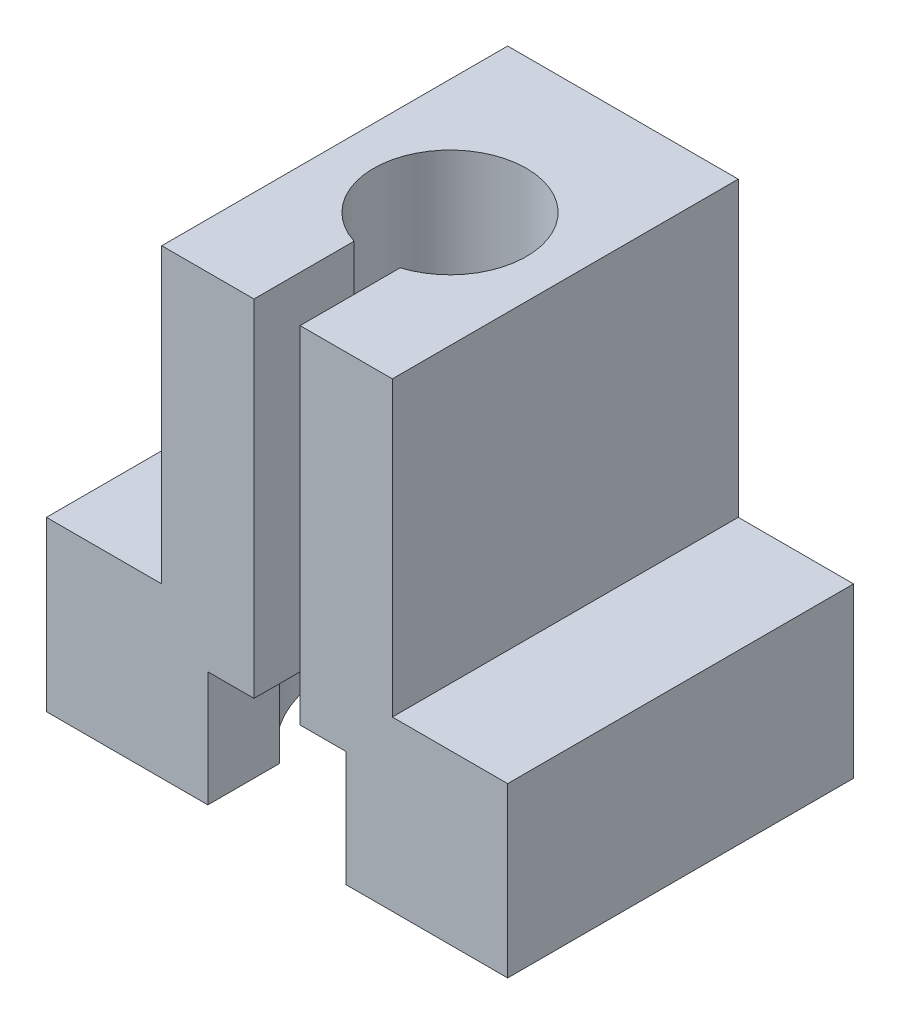
ISO-10303-21;
HEADER;
FILE_DESCRIPTION(('STEP AP214'),'2;1');
FILE_NAME('part.step','',(''),(''),'','','');
FILE_SCHEMA(('AUTOMOTIVE_DESIGN { 1 0 10303 214 1 1 1 1 }'));
ENDSEC;
DATA;
#1=APPLICATION_CONTEXT('core data for automotive mechanical design processes');
#2=APPLICATION_PROTOCOL_DEFINITION('international standard','automotive_design',2000,#1);
#3=PRODUCT_CONTEXT('',#1,'mechanical');
#4=PRODUCT('Part','Part','',(#3));
#5=PRODUCT_RELATED_PRODUCT_CATEGORY('part','',(#4));
#6=PRODUCT_DEFINITION_FORMATION('','',#4);
#7=PRODUCT_DEFINITION_CONTEXT('part definition',#1,'design');
#8=PRODUCT_DEFINITION('design','',#6,#7);
#9=PRODUCT_DEFINITION_SHAPE('','',#8);
#10=(LENGTH_UNIT() NAMED_UNIT(*) SI_UNIT(.MILLI.,.METRE.));
#11=(NAMED_UNIT(*) PLANE_ANGLE_UNIT() SI_UNIT($,.RADIAN.));
#12=(NAMED_UNIT(*) SI_UNIT($,.STERADIAN.) SOLID_ANGLE_UNIT());
#13=UNCERTAINTY_MEASURE_WITH_UNIT(LENGTH_MEASURE(1.E-05),#10,'distance_accuracy_value','');
#14=(GEOMETRIC_REPRESENTATION_CONTEXT(3) GLOBAL_UNCERTAINTY_ASSIGNED_CONTEXT((#13)) GLOBAL_UNIT_ASSIGNED_CONTEXT((#10,
#11,#12)) REPRESENTATION_CONTEXT('',''));
#15=CARTESIAN_POINT('',(0.,0.,0.));
#16=DIRECTION('',(0.,0.,1.));
#17=DIRECTION('',(1.,0.,0.));
#18=AXIS2_PLACEMENT_3D('',#15,#16,#17);
#19=CARTESIAN_POINT('',(-5.,-7.5,15.));
#20=DIRECTION('',(0.,1.,0.));
#21=DIRECTION('',(0.,0.,1.));
#22=AXIS2_PLACEMENT_3D('',#19,#20,#21);
#23=PLANE('',#22);
#24=DIRECTION('',(0.,0.,1.));
#25=VECTOR('',#24,1.);
#26=CARTESIAN_POINT('',(-3.,-7.5,15.));
#27=LINE('',#26,#25);
#28=CARTESIAN_POINT('',(-3.,-7.5,11.8873938733604));
#29=VERTEX_POINT('',#28);
#30=CARTESIAN_POINT('',(-3.,-7.5,15.));
#31=VERTEX_POINT('',#30);
#32=EDGE_CURVE('E54',#29,#31,#27,.T.);
#33=ORIENTED_EDGE('',*,*,#32,.F.);
#34=CARTESIAN_POINT('',(0.,-7.5,7.50000000000005));
#35=DIRECTION('',(0.,1.,0.));
#36=DIRECTION('',(0.,0.,-1.));
#37=AXIS2_PLACEMENT_3D('',#34,#35,#36);
#38=CIRCLE('',#37,5.315);
#39=CARTESIAN_POINT('',(3.,-7.5,11.8873938733604));
#40=VERTEX_POINT('',#39);
#41=EDGE_CURVE('E177',#40,#29,#38,.T.);
#42=ORIENTED_EDGE('',*,*,#41,.F.);
#43=DIRECTION('',(0.,0.,-1.));
#44=VECTOR('',#43,1.);
#45=CARTESIAN_POINT('',(3.,-7.5,11.8873938733604));
#46=LINE('',#45,#44);
#47=CARTESIAN_POINT('',(3.,-7.5,15.));
#48=VERTEX_POINT('',#47);
#49=EDGE_CURVE('E191',#48,#40,#46,.T.);
#50=ORIENTED_EDGE('',*,*,#49,.F.);
#51=DIRECTION('',(1.,0.,0.));
#52=VECTOR('',#51,1.);
#53=CARTESIAN_POINT('',(-5.,-7.5,15.));
#54=LINE('',#53,#52);
#55=CARTESIAN_POINT('',(1.,-7.5,15.));
#56=VERTEX_POINT('',#55);
#57=EDGE_CURVE('E261',#56,#48,#54,.T.);
#58=ORIENTED_EDGE('',*,*,#57,.F.);
#59=DIRECTION('',(0.,0.,1.));
#60=VECTOR('',#59,1.);
#61=CARTESIAN_POINT('',(1.,-7.5,7.));
#62=LINE('',#61,#60);
#63=CARTESIAN_POINT('',(1.,-7.5,10.6605735239036));
#64=VERTEX_POINT('',#63);
#65=EDGE_CURVE('E212',#64,#56,#62,.T.);
#66=ORIENTED_EDGE('',*,*,#65,.F.);
#67=CARTESIAN_POINT('',(0.,-7.5,7.50000000000005));
#68=DIRECTION('',(0.,-1.,0.));
#69=DIRECTION('',(0.,0.,-1.));
#70=AXIS2_PLACEMENT_3D('',#67,#68,#69);
#71=CIRCLE('',#70,3.315);
#72=CARTESIAN_POINT('',(-1.,-7.5,10.6605735239036));
#73=VERTEX_POINT('',#72);
#74=EDGE_CURVE('E214',#73,#64,#71,.T.);
#75=ORIENTED_EDGE('',*,*,#74,.F.);
#76=DIRECTION('',(0.,0.,1.));
#77=VECTOR('',#76,1.);
#78=CARTESIAN_POINT('',(-1.,-7.5,7.));
#79=LINE('',#78,#77);
#80=CARTESIAN_POINT('',(-1.,-7.5,15.));
#81=VERTEX_POINT('',#80);
#82=EDGE_CURVE('E215',#73,#81,#79,.T.);
#83=ORIENTED_EDGE('',*,*,#82,.T.);
#84=EDGE_CURVE('E59',#31,#81,#54,.T.);
#85=ORIENTED_EDGE('',*,*,#84,.F.);
#86=EDGE_LOOP('',(#33,#42,#50,#58,#66,#75,#83,#85));
#87=FACE_BOUND('',#86,.T.);
#88=ADVANCED_FACE('F39',(#87),#23,.F.);
#89=CARTESIAN_POINT('',(0.,0.,15.));
#90=DIRECTION('',(0.,0.,1.));
#91=DIRECTION('',(1.,0.,0.));
#92=AXIS2_PLACEMENT_3D('',#89,#90,#91);
#93=PLANE('',#92);
#94=DIRECTION('',(0.,1.,0.));
#95=VECTOR('',#94,1.);
#96=CARTESIAN_POINT('',(1.,7.5,15.));
#97=LINE('',#96,#95);
#98=CARTESIAN_POINT('',(1.,7.5,15.));
#99=VERTEX_POINT('',#98);
#100=EDGE_CURVE('E206',#56,#99,#97,.T.);
#101=ORIENTED_EDGE('',*,*,#100,.F.);
#102=ORIENTED_EDGE('',*,*,#57,.T.);
#103=DIRECTION('',(0.,1.,0.));
#104=VECTOR('',#103,1.);
#105=CARTESIAN_POINT('',(3.,-12.5,15.));
#106=LINE('',#105,#104);
#107=CARTESIAN_POINT('',(3.,-12.5,15.));
#108=VERTEX_POINT('',#107);
#109=EDGE_CURVE('E203',#108,#48,#106,.T.);
#110=ORIENTED_EDGE('',*,*,#109,.F.);
#111=DIRECTION('',(-1.,0.,0.));
#112=VECTOR('',#111,1.);
#113=CARTESIAN_POINT('',(3.,-12.5,15.));
#114=LINE('',#113,#112);
#115=CARTESIAN_POINT('',(10.,-12.5,15.));
#116=VERTEX_POINT('',#115);
#117=EDGE_CURVE('E181',#116,#108,#114,.T.);
#118=ORIENTED_EDGE('',*,*,#117,.F.);
#119=DIRECTION('',(0.,1.,0.));
#120=VECTOR('',#119,1.);
#121=CARTESIAN_POINT('',(10.,-5.2,15.));
#122=LINE('',#121,#120);
#123=CARTESIAN_POINT('',(10.,-5.2,15.));
#124=VERTEX_POINT('',#123);
#125=EDGE_CURVE('E235',#116,#124,#122,.T.);
#126=ORIENTED_EDGE('',*,*,#125,.T.);
#127=DIRECTION('',(-1.,0.,0.));
#128=VECTOR('',#127,1.);
#129=CARTESIAN_POINT('',(5.,-5.2,15.));
#130=LINE('',#129,#128);
#131=CARTESIAN_POINT('',(5.,-5.2,15.));
#132=VERTEX_POINT('',#131);
#133=EDGE_CURVE('E229',#124,#132,#130,.T.);
#134=ORIENTED_EDGE('',*,*,#133,.T.);
#135=DIRECTION('',(0.,1.,0.));
#136=VECTOR('',#135,1.);
#137=CARTESIAN_POINT('',(5.,7.5,15.));
#138=LINE('',#137,#136);
#139=CARTESIAN_POINT('',(5.,7.5,15.));
#140=VERTEX_POINT('',#139);
#141=EDGE_CURVE('E251',#132,#140,#138,.T.);
#142=ORIENTED_EDGE('',*,*,#141,.T.);
#143=DIRECTION('',(-1.,0.,0.));
#144=VECTOR('',#143,1.);
#145=CARTESIAN_POINT('',(-5.,7.5,15.));
#146=LINE('',#145,#144);
#147=EDGE_CURVE('E255',#140,#99,#146,.T.);
#148=ORIENTED_EDGE('',*,*,#147,.T.);
#149=EDGE_LOOP('',(#101,#102,#110,#118,#126,#134,#142,#148));
#150=FACE_BOUND('',#149,.T.);
#151=ADVANCED_FACE('F287',(#150),#93,.T.);
#152=CARTESIAN_POINT('',(5.,7.5,15.));
#153=DIRECTION('',(-1.,0.,0.));
#154=DIRECTION('',(0.,0.,1.));
#155=AXIS2_PLACEMENT_3D('',#152,#153,#154);
#156=PLANE('',#155);
#157=DIRECTION('',(0.,0.,1.));
#158=VECTOR('',#157,1.);
#159=CARTESIAN_POINT('',(5.,-5.2,-5.5036351623268));
#160=LINE('',#159,#158);
#161=CARTESIAN_POINT('',(5.,-5.2,0.));
#162=VERTEX_POINT('',#161);
#163=EDGE_CURVE('E230',#162,#132,#160,.T.);
#164=ORIENTED_EDGE('',*,*,#163,.F.);
#165=DIRECTION('',(0.,1.,0.));
#166=VECTOR('',#165,1.);
#167=CARTESIAN_POINT('',(5.,7.5,0.));
#168=LINE('',#167,#166);
#169=CARTESIAN_POINT('',(5.,7.5,0.));
#170=VERTEX_POINT('',#169);
#171=EDGE_CURVE('E250',#162,#170,#168,.T.);
#172=ORIENTED_EDGE('',*,*,#171,.T.);
#173=DIRECTION('',(0.,0.,-1.));
#174=VECTOR('',#173,1.);
#175=CARTESIAN_POINT('',(5.,7.5,15.));
#176=LINE('',#175,#174);
#177=EDGE_CURVE('E271',#140,#170,#176,.T.);
#178=ORIENTED_EDGE('',*,*,#177,.F.);
#179=ORIENTED_EDGE('',*,*,#141,.F.);
#180=EDGE_LOOP('',(#164,#172,#178,#179));
#181=FACE_BOUND('',#180,.T.);
#182=ADVANCED_FACE('F41',(#181),#156,.F.);
#183=CARTESIAN_POINT('',(-5.,7.5,15.));
#184=DIRECTION('',(0.,-1.,0.));
#185=DIRECTION('',(0.,0.,-1.));
#186=AXIS2_PLACEMENT_3D('',#183,#184,#185);
#187=PLANE('',#186);
#188=CARTESIAN_POINT('',(0.,7.5,7.50000000000005));
#189=DIRECTION('',(0.,-1.,0.));
#190=DIRECTION('',(0.,0.,-1.));
#191=AXIS2_PLACEMENT_3D('',#188,#189,#190);
#192=CIRCLE('',#191,3.315);
#193=CARTESIAN_POINT('',(-1.,7.5,10.6605735239036));
#194=VERTEX_POINT('',#193);
#195=CARTESIAN_POINT('',(1.,7.5,10.6605735239036));
#196=VERTEX_POINT('',#195);
#197=EDGE_CURVE('E221',#194,#196,#192,.T.);
#198=ORIENTED_EDGE('',*,*,#197,.T.);
#199=DIRECTION('',(0.,0.,1.));
#200=VECTOR('',#199,1.);
#201=CARTESIAN_POINT('',(1.,7.5,7.));
#202=LINE('',#201,#200);
#203=EDGE_CURVE('E211',#196,#99,#202,.T.);
#204=ORIENTED_EDGE('',*,*,#203,.T.);
#205=ORIENTED_EDGE('',*,*,#147,.F.);
#206=ORIENTED_EDGE('',*,*,#177,.T.);
#207=DIRECTION('',(-1.,0.,0.));
#208=VECTOR('',#207,1.);
#209=CARTESIAN_POINT('',(-5.,7.5,0.));
#210=LINE('',#209,#208);
#211=CARTESIAN_POINT('',(-5.,7.5,0.));
#212=VERTEX_POINT('',#211);
#213=EDGE_CURVE('E265',#170,#212,#210,.T.);
#214=ORIENTED_EDGE('',*,*,#213,.T.);
#215=DIRECTION('',(0.,0.,-1.));
#216=VECTOR('',#215,1.);
#217=CARTESIAN_POINT('',(-5.,7.5,15.));
#218=LINE('',#217,#216);
#219=CARTESIAN_POINT('',(-5.,7.5,15.));
#220=VERTEX_POINT('',#219);
#221=EDGE_CURVE('E263',#220,#212,#218,.T.);
#222=ORIENTED_EDGE('',*,*,#221,.F.);
#223=CARTESIAN_POINT('',(-1.,7.5,15.));
#224=VERTEX_POINT('',#223);
#225=EDGE_CURVE('E253',#224,#220,#146,.T.);
#226=ORIENTED_EDGE('',*,*,#225,.F.);
#227=DIRECTION('',(0.,0.,1.));
#228=VECTOR('',#227,1.);
#229=CARTESIAN_POINT('',(-1.,7.5,7.));
#230=LINE('',#229,#228);
#231=EDGE_CURVE('E217',#194,#224,#230,.T.);
#232=ORIENTED_EDGE('',*,*,#231,.F.);
#233=EDGE_LOOP('',(#198,#204,#205,#206,#214,#222,#226,#232));
#234=FACE_BOUND('',#233,.T.);
#235=ADVANCED_FACE('F292',(#234),#187,.F.);
#236=CARTESIAN_POINT('',(-5.,7.5,15.));
#237=DIRECTION('',(1.,0.,0.));
#238=DIRECTION('',(0.,0.,-1.));
#239=AXIS2_PLACEMENT_3D('',#236,#237,#238);
#240=PLANE('',#239);
#241=DIRECTION('',(0.,-1.,0.));
#242=VECTOR('',#241,1.);
#243=CARTESIAN_POINT('',(-5.,7.5,0.));
#244=LINE('',#243,#242);
#245=CARTESIAN_POINT('',(-5.,-5.2,0.));
#246=VERTEX_POINT('',#245);
#247=EDGE_CURVE('E254',#212,#246,#244,.T.);
#248=ORIENTED_EDGE('',*,*,#247,.T.);
#249=DIRECTION('',(0.,0.,1.));
#250=VECTOR('',#249,1.);
#251=CARTESIAN_POINT('',(-5.,-5.2,-5.5036351623268));
#252=LINE('',#251,#250);
#253=CARTESIAN_POINT('',(-5.,-5.2,15.));
#254=VERTEX_POINT('',#253);
#255=EDGE_CURVE('E245',#246,#254,#252,.T.);
#256=ORIENTED_EDGE('',*,*,#255,.T.);
#257=DIRECTION('',(0.,-1.,0.));
#258=VECTOR('',#257,1.);
#259=CARTESIAN_POINT('',(-5.,7.5,15.));
#260=LINE('',#259,#258);
#261=EDGE_CURVE('E258',#220,#254,#260,.T.);
#262=ORIENTED_EDGE('',*,*,#261,.F.);
#263=ORIENTED_EDGE('',*,*,#221,.T.);
#264=EDGE_LOOP('',(#248,#256,#262,#263));
#265=FACE_BOUND('',#264,.T.);
#266=ADVANCED_FACE('F301',(#265),#240,.F.);
#267=DIRECTION('',(0.,-1.,0.));
#268=VECTOR('',#267,1.);
#269=CARTESIAN_POINT('',(-1.,7.5,15.));
#270=LINE('',#269,#268);
#271=EDGE_CURVE('E208',#224,#81,#270,.T.);
#272=ORIENTED_EDGE('',*,*,#271,.F.);
#273=ORIENTED_EDGE('',*,*,#225,.T.);
#274=ORIENTED_EDGE('',*,*,#261,.T.);
#275=DIRECTION('',(-1.,0.,0.));
#276=VECTOR('',#275,1.);
#277=CARTESIAN_POINT('',(-5.,-5.2,15.));
#278=LINE('',#277,#276);
#279=CARTESIAN_POINT('',(-10.,-5.2,15.));
#280=VERTEX_POINT('',#279);
#281=EDGE_CURVE('E238',#254,#280,#278,.T.);
#282=ORIENTED_EDGE('',*,*,#281,.T.);
#283=DIRECTION('',(0.,-1.,0.));
#284=VECTOR('',#283,1.);
#285=CARTESIAN_POINT('',(-10.,-5.2,15.));
#286=LINE('',#285,#284);
#287=CARTESIAN_POINT('',(-10.,-12.5,15.));
#288=VERTEX_POINT('',#287);
#289=EDGE_CURVE('E243',#280,#288,#286,.T.);
#290=ORIENTED_EDGE('',*,*,#289,.T.);
#291=DIRECTION('',(-1.,0.,0.));
#292=VECTOR('',#291,1.);
#293=CARTESIAN_POINT('',(-10.,-12.5,15.));
#294=LINE('',#293,#292);
#295=CARTESIAN_POINT('',(-3.,-12.5,15.));
#296=VERTEX_POINT('',#295);
#297=EDGE_CURVE('E175',#296,#288,#294,.T.);
#298=ORIENTED_EDGE('',*,*,#297,.F.);
#299=DIRECTION('',(0.,1.,0.));
#300=VECTOR('',#299,1.);
#301=CARTESIAN_POINT('',(-3.,-12.5,15.));
#302=LINE('',#301,#300);
#303=EDGE_CURVE('E190',#296,#31,#302,.T.);
#304=ORIENTED_EDGE('',*,*,#303,.T.);
#305=ORIENTED_EDGE('',*,*,#84,.T.);
#306=EDGE_LOOP('',(#272,#273,#274,#282,#290,#298,#304,#305));
#307=FACE_BOUND('',#306,.T.);
#308=ADVANCED_FACE('F305',(#307),#93,.T.);
#309=CARTESIAN_POINT('',(0.,0.,0.));
#310=DIRECTION('',(0.,0.,1.));
#311=DIRECTION('',(1.,0.,0.));
#312=AXIS2_PLACEMENT_3D('',#309,#310,#311);
#313=PLANE('',#312);
#314=ORIENTED_EDGE('',*,*,#171,.F.);
#315=DIRECTION('',(1.,0.,0.));
#316=VECTOR('',#315,1.);
#317=CARTESIAN_POINT('',(5.,-5.2,0.));
#318=LINE('',#317,#316);
#319=CARTESIAN_POINT('',(10.,-5.2,0.));
#320=VERTEX_POINT('',#319);
#321=EDGE_CURVE('E224',#162,#320,#318,.T.);
#322=ORIENTED_EDGE('',*,*,#321,.T.);
#323=DIRECTION('',(0.,-1.,0.));
#324=VECTOR('',#323,1.);
#325=CARTESIAN_POINT('',(10.,-5.2,0.));
#326=LINE('',#325,#324);
#327=CARTESIAN_POINT('',(10.,-12.5,0.));
#328=VERTEX_POINT('',#327);
#329=EDGE_CURVE('E166',#320,#328,#326,.T.);
#330=ORIENTED_EDGE('',*,*,#329,.T.);
#331=DIRECTION('',(1.,0.,0.));
#332=VECTOR('',#331,1.);
#333=CARTESIAN_POINT('',(10.,-12.5,0.));
#334=LINE('',#333,#332);
#335=CARTESIAN_POINT('',(-10.,-12.5,0.));
#336=VERTEX_POINT('',#335);
#337=EDGE_CURVE('E162',#336,#328,#334,.T.);
#338=ORIENTED_EDGE('',*,*,#337,.F.);
#339=DIRECTION('',(0.,1.,0.));
#340=VECTOR('',#339,1.);
#341=CARTESIAN_POINT('',(-10.,-5.2,0.));
#342=LINE('',#341,#340);
#343=CARTESIAN_POINT('',(-10.,-5.2,0.));
#344=VERTEX_POINT('',#343);
#345=EDGE_CURVE('E150',#336,#344,#342,.T.);
#346=ORIENTED_EDGE('',*,*,#345,.T.);
#347=DIRECTION('',(1.,0.,0.));
#348=VECTOR('',#347,1.);
#349=CARTESIAN_POINT('',(-5.,-5.2,0.));
#350=LINE('',#349,#348);
#351=EDGE_CURVE('E159',#344,#246,#350,.T.);
#352=ORIENTED_EDGE('',*,*,#351,.T.);
#353=ORIENTED_EDGE('',*,*,#247,.F.);
#354=ORIENTED_EDGE('',*,*,#213,.F.);
#355=EDGE_LOOP('',(#314,#322,#330,#338,#346,#352,#353,#354));
#356=FACE_BOUND('',#355,.T.);
#357=ADVANCED_FACE('F164',(#356),#313,.F.);
#358=CARTESIAN_POINT('',(-10.,-5.2,-5.5036351623268));
#359=DIRECTION('',(-1.,0.,0.));
#360=DIRECTION('',(0.,-1.,0.));
#361=AXIS2_PLACEMENT_3D('',#358,#359,#360);
#362=PLANE('',#361);
#363=ORIENTED_EDGE('',*,*,#345,.F.);
#364=DIRECTION('',(0.,0.,-1.));
#365=VECTOR('',#364,1.);
#366=CARTESIAN_POINT('',(-10.,-12.5,0.));
#367=LINE('',#366,#365);
#368=EDGE_CURVE('E155',#288,#336,#367,.T.);
#369=ORIENTED_EDGE('',*,*,#368,.F.);
#370=ORIENTED_EDGE('',*,*,#289,.F.);
#371=DIRECTION('',(0.,0.,1.));
#372=VECTOR('',#371,1.);
#373=CARTESIAN_POINT('',(-10.,-5.2,-5.5036351623268));
#374=LINE('',#373,#372);
#375=EDGE_CURVE('E156',#344,#280,#374,.T.);
#376=ORIENTED_EDGE('',*,*,#375,.F.);
#377=EDGE_LOOP('',(#363,#369,#370,#376));
#378=FACE_BOUND('',#377,.T.);
#379=ADVANCED_FACE('F152',(#378),#362,.T.);
#380=CARTESIAN_POINT('',(-5.,-5.2,-5.5036351623268));
#381=DIRECTION('',(0.,1.,0.));
#382=DIRECTION('',(0.,0.,1.));
#383=AXIS2_PLACEMENT_3D('',#380,#381,#382);
#384=PLANE('',#383);
#385=ORIENTED_EDGE('',*,*,#351,.F.);
#386=ORIENTED_EDGE('',*,*,#375,.T.);
#387=ORIENTED_EDGE('',*,*,#281,.F.);
#388=ORIENTED_EDGE('',*,*,#255,.F.);
#389=EDGE_LOOP('',(#385,#386,#387,#388));
#390=FACE_BOUND('',#389,.T.);
#391=ADVANCED_FACE('F345',(#390),#384,.T.);
#392=CARTESIAN_POINT('',(5.,-5.2,-5.5036351623268));
#393=DIRECTION('',(0.,1.,0.));
#394=DIRECTION('',(0.,0.,1.));
#395=AXIS2_PLACEMENT_3D('',#392,#393,#394);
#396=PLANE('',#395);
#397=ORIENTED_EDGE('',*,*,#321,.F.);
#398=ORIENTED_EDGE('',*,*,#163,.T.);
#399=ORIENTED_EDGE('',*,*,#133,.F.);
#400=DIRECTION('',(0.,0.,1.));
#401=VECTOR('',#400,1.);
#402=CARTESIAN_POINT('',(10.,-5.2,-5.5036351623268));
#403=LINE('',#402,#401);
#404=EDGE_CURVE('E227',#320,#124,#403,.T.);
#405=ORIENTED_EDGE('',*,*,#404,.F.);
#406=EDGE_LOOP('',(#397,#398,#399,#405));
#407=FACE_BOUND('',#406,.T.);
#408=ADVANCED_FACE('F348',(#407),#396,.T.);
#409=CARTESIAN_POINT('',(10.,-5.2,-5.5036351623268));
#410=DIRECTION('',(1.,0.,0.));
#411=DIRECTION('',(0.,1.,0.));
#412=AXIS2_PLACEMENT_3D('',#409,#410,#411);
#413=PLANE('',#412);
#414=ORIENTED_EDGE('',*,*,#329,.F.);
#415=ORIENTED_EDGE('',*,*,#404,.T.);
#416=ORIENTED_EDGE('',*,*,#125,.F.);
#417=DIRECTION('',(0.,0.,1.));
#418=VECTOR('',#417,1.);
#419=CARTESIAN_POINT('',(10.,-12.5,15.));
#420=LINE('',#419,#418);
#421=EDGE_CURVE('E170',#328,#116,#420,.T.);
#422=ORIENTED_EDGE('',*,*,#421,.F.);
#423=EDGE_LOOP('',(#414,#415,#416,#422));
#424=FACE_BOUND('',#423,.T.);
#425=ADVANCED_FACE('F315',(#424),#413,.T.);
#426=CARTESIAN_POINT('',(0.,7.5,7.50000000000005));
#427=DIRECTION('',(0.,-1.,0.));
#428=DIRECTION('',(0.,0.,-1.));
#429=AXIS2_PLACEMENT_3D('',#426,#427,#428);
#430=CYLINDRICAL_SURFACE('',#429,3.315);
#431=ORIENTED_EDGE('',*,*,#74,.T.);
#432=DIRECTION('',(0.,-1.,0.));
#433=VECTOR('',#432,1.);
#434=CARTESIAN_POINT('',(1.,7.5,10.6605735239036));
#435=LINE('',#434,#433);
#436=EDGE_CURVE('E11',#64,#196,#435,.F.);
#437=ORIENTED_EDGE('',*,*,#436,.T.);
#438=ORIENTED_EDGE('',*,*,#197,.F.);
#439=DIRECTION('',(0.,-1.,0.));
#440=VECTOR('',#439,1.);
#441=CARTESIAN_POINT('',(-1.,7.5,10.6605735239036));
#442=LINE('',#441,#440);
#443=EDGE_CURVE('E47',#194,#73,#442,.T.);
#444=ORIENTED_EDGE('',*,*,#443,.T.);
#445=EDGE_LOOP('',(#431,#437,#438,#444));
#446=FACE_BOUND('',#445,.T.);
#447=ADVANCED_FACE('F277',(#446),#430,.F.);
#448=CARTESIAN_POINT('',(-1.,7.5,7.));
#449=DIRECTION('',(-1.,0.,0.));
#450=DIRECTION('',(0.,0.,1.));
#451=AXIS2_PLACEMENT_3D('',#448,#449,#450);
#452=PLANE('',#451);
#453=ORIENTED_EDGE('',*,*,#231,.T.);
#454=ORIENTED_EDGE('',*,*,#271,.T.);
#455=ORIENTED_EDGE('',*,*,#82,.F.);
#456=ORIENTED_EDGE('',*,*,#443,.F.);
#457=EDGE_LOOP('',(#453,#454,#455,#456));
#458=FACE_BOUND('',#457,.T.);
#459=ADVANCED_FACE('F306',(#458),#452,.F.);
#460=CARTESIAN_POINT('',(1.,7.5,7.));
#461=DIRECTION('',(1.,0.,0.));
#462=DIRECTION('',(0.,0.,-1.));
#463=AXIS2_PLACEMENT_3D('',#460,#461,#462);
#464=PLANE('',#463);
#465=ORIENTED_EDGE('',*,*,#65,.T.);
#466=ORIENTED_EDGE('',*,*,#100,.T.);
#467=ORIENTED_EDGE('',*,*,#203,.F.);
#468=ORIENTED_EDGE('',*,*,#436,.F.);
#469=EDGE_LOOP('',(#465,#466,#467,#468));
#470=FACE_BOUND('',#469,.T.);
#471=ADVANCED_FACE('F285',(#470),#464,.F.);
#472=CARTESIAN_POINT('',(3.,-12.5,11.8873938733604));
#473=DIRECTION('',(1.,0.,0.));
#474=DIRECTION('',(0.,0.,-1.));
#475=AXIS2_PLACEMENT_3D('',#472,#473,#474);
#476=PLANE('',#475);
#477=ORIENTED_EDGE('',*,*,#49,.T.);
#478=DIRECTION('',(0.,1.,0.));
#479=VECTOR('',#478,1.);
#480=CARTESIAN_POINT('',(3.,-12.5,11.8873938733604));
#481=LINE('',#480,#479);
#482=CARTESIAN_POINT('',(3.,-12.5,11.8873938733604));
#483=VERTEX_POINT('',#482);
#484=EDGE_CURVE('E200',#483,#40,#481,.T.);
#485=ORIENTED_EDGE('',*,*,#484,.F.);
#486=DIRECTION('',(0.,0.,-1.));
#487=VECTOR('',#486,1.);
#488=CARTESIAN_POINT('',(3.,-12.5,11.8873938733604));
#489=LINE('',#488,#487);
#490=EDGE_CURVE('E183',#108,#483,#489,.T.);
#491=ORIENTED_EDGE('',*,*,#490,.F.);
#492=ORIENTED_EDGE('',*,*,#109,.T.);
#493=EDGE_LOOP('',(#477,#485,#491,#492));
#494=FACE_BOUND('',#493,.T.);
#495=ADVANCED_FACE('F313',(#494),#476,.F.);
#496=CARTESIAN_POINT('',(0.,-12.5,7.50000000000005));
#497=DIRECTION('',(0.,1.,0.));
#498=DIRECTION('',(0.,0.,1.));
#499=AXIS2_PLACEMENT_3D('',#496,#497,#498);
#500=CYLINDRICAL_SURFACE('',#499,5.315);
#501=ORIENTED_EDGE('',*,*,#41,.T.);
#502=DIRECTION('',(0.,1.,0.));
#503=VECTOR('',#502,1.);
#504=CARTESIAN_POINT('',(-3.,-12.5,11.8873938733604));
#505=LINE('',#504,#503);
#506=CARTESIAN_POINT('',(-3.,-12.5,11.8873938733604));
#507=VERTEX_POINT('',#506);
#508=EDGE_CURVE('E197',#507,#29,#505,.T.);
#509=ORIENTED_EDGE('',*,*,#508,.F.);
#510=CARTESIAN_POINT('',(0.,-12.5,7.50000000000005));
#511=DIRECTION('',(0.,1.,0.));
#512=DIRECTION('',(0.,0.,-1.));
#513=AXIS2_PLACEMENT_3D('',#510,#511,#512);
#514=CIRCLE('',#513,5.315);
#515=EDGE_CURVE('E185',#483,#507,#514,.T.);
#516=ORIENTED_EDGE('',*,*,#515,.F.);
#517=ORIENTED_EDGE('',*,*,#484,.T.);
#518=EDGE_LOOP('',(#501,#509,#516,#517));
#519=FACE_BOUND('',#518,.T.);
#520=ADVANCED_FACE('F447',(#519),#500,.F.);
#521=CARTESIAN_POINT('',(-3.,-12.5,15.));
#522=DIRECTION('',(-1.,0.,0.));
#523=DIRECTION('',(0.,0.,1.));
#524=AXIS2_PLACEMENT_3D('',#521,#522,#523);
#525=PLANE('',#524);
#526=ORIENTED_EDGE('',*,*,#32,.T.);
#527=ORIENTED_EDGE('',*,*,#303,.F.);
#528=DIRECTION('',(0.,0.,1.));
#529=VECTOR('',#528,1.);
#530=CARTESIAN_POINT('',(-3.,-12.5,15.));
#531=LINE('',#530,#529);
#532=EDGE_CURVE('E187',#507,#296,#531,.T.);
#533=ORIENTED_EDGE('',*,*,#532,.F.);
#534=ORIENTED_EDGE('',*,*,#508,.T.);
#535=EDGE_LOOP('',(#526,#527,#533,#534));
#536=FACE_BOUND('',#535,.T.);
#537=ADVANCED_FACE('F454',(#536),#525,.F.);
#538=CARTESIAN_POINT('',(0.,-12.5,7.50000000000005));
#539=DIRECTION('',(0.,-1.,0.));
#540=DIRECTION('',(0.,0.,-1.));
#541=AXIS2_PLACEMENT_3D('',#538,#539,#540);
#542=PLANE('',#541);
#543=ORIENTED_EDGE('',*,*,#368,.T.);
#544=ORIENTED_EDGE('',*,*,#337,.T.);
#545=ORIENTED_EDGE('',*,*,#421,.T.);
#546=ORIENTED_EDGE('',*,*,#117,.T.);
#547=ORIENTED_EDGE('',*,*,#490,.T.);
#548=ORIENTED_EDGE('',*,*,#515,.T.);
#549=ORIENTED_EDGE('',*,*,#532,.T.);
#550=ORIENTED_EDGE('',*,*,#297,.T.);
#551=EDGE_LOOP('',(#543,#544,#545,#546,#547,#548,#549,#550));
#552=FACE_BOUND('',#551,.T.);
#553=ADVANCED_FACE('F173',(#552),#542,.T.);
#554=CLOSED_SHELL('',(#88,#151,#182,#235,#266,#308,#357,#379,#391,#408,#425,#447,#459,#471,#495,
#520,#537,#553));
#555=MANIFOLD_SOLID_BREP('B2',#554);
#556=ADVANCED_BREP_SHAPE_REPRESENTATION('',(#18,#555),#14);
#557=SHAPE_DEFINITION_REPRESENTATION(#9,#556);
ENDSEC;
END-ISO-10303-21;
